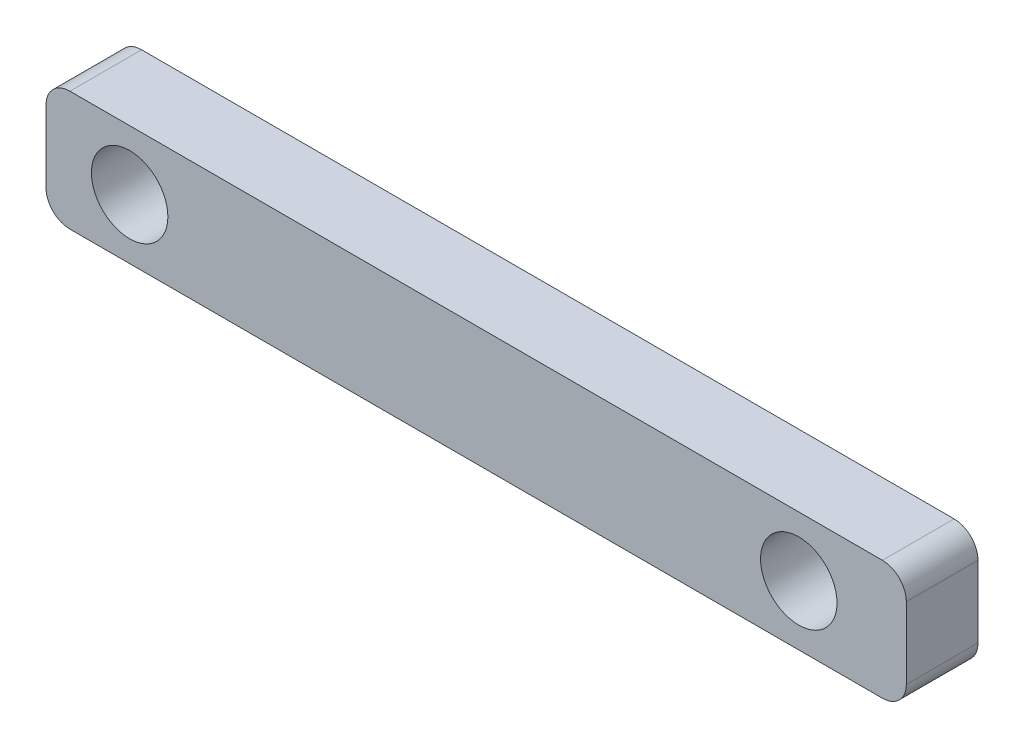
ISO-10303-21;
HEADER;
FILE_DESCRIPTION(('STEP AP214'),'2;1');
FILE_NAME('part.step','',(''),(''),'','','');
FILE_SCHEMA(('AUTOMOTIVE_DESIGN { 1 0 10303 214 1 1 1 1 }'));
ENDSEC;
DATA;
#1=APPLICATION_CONTEXT('core data for automotive mechanical design processes');
#2=APPLICATION_PROTOCOL_DEFINITION('international standard','automotive_design',2000,#1);
#3=PRODUCT_CONTEXT('',#1,'mechanical');
#4=PRODUCT('Part','Part','',(#3));
#5=PRODUCT_RELATED_PRODUCT_CATEGORY('part','',(#4));
#6=PRODUCT_DEFINITION_FORMATION('','',#4);
#7=PRODUCT_DEFINITION_CONTEXT('part definition',#1,'design');
#8=PRODUCT_DEFINITION('design','',#6,#7);
#9=PRODUCT_DEFINITION_SHAPE('','',#8);
#10=(LENGTH_UNIT() NAMED_UNIT(*) SI_UNIT(.MILLI.,.METRE.));
#11=(NAMED_UNIT(*) PLANE_ANGLE_UNIT() SI_UNIT($,.RADIAN.));
#12=(NAMED_UNIT(*) SI_UNIT($,.STERADIAN.) SOLID_ANGLE_UNIT());
#13=UNCERTAINTY_MEASURE_WITH_UNIT(LENGTH_MEASURE(1.E-05),#10,'distance_accuracy_value','');
#14=(GEOMETRIC_REPRESENTATION_CONTEXT(3) GLOBAL_UNCERTAINTY_ASSIGNED_CONTEXT((#13)) GLOBAL_UNIT_ASSIGNED_CONTEXT((#10,
#11,#12)) REPRESENTATION_CONTEXT('',''));
#15=CARTESIAN_POINT('',(0.,0.,0.));
#16=DIRECTION('',(0.,0.,1.));
#17=DIRECTION('',(1.,0.,0.));
#18=AXIS2_PLACEMENT_3D('',#15,#16,#17);
#19=CARTESIAN_POINT('',(46.825055764785,-11.3855235849937,3.));
#20=DIRECTION('',(0.,0.,1.));
#21=DIRECTION('',(1.,0.,0.));
#22=AXIS2_PLACEMENT_3D('',#19,#20,#21);
#23=PLANE('',#22);
#24=CARTESIAN_POINT('',(15.325055764785,-9.88552358499371,3.));
#25=DIRECTION('',(0.,0.,1.));
#26=DIRECTION('',(1.,0.,0.));
#27=AXIS2_PLACEMENT_3D('',#24,#25,#26);
#28=CIRCLE('',#27,1.59999999999999);
#29=CARTESIAN_POINT('',(16.925055764785,-9.88552358499371,3.));
#30=VERTEX_POINT('',#29);
#31=EDGE_CURVE('E138',#30,#30,#28,.T.);
#32=ORIENTED_EDGE('',*,*,#31,.F.);
#33=EDGE_LOOP('',(#32));
#34=FACE_BOUND('',#33,.T.);
#35=CARTESIAN_POINT('',(46.825055764785,-11.3855235849937,3.));
#36=DIRECTION('',(0.,0.,1.));
#37=DIRECTION('',(1.,0.,0.));
#38=AXIS2_PLACEMENT_3D('',#35,#36,#37);
#39=CIRCLE('',#38,1.);
#40=CARTESIAN_POINT('',(46.825055764785,-12.3855235849937,3.));
#41=VERTEX_POINT('',#40);
#42=CARTESIAN_POINT('',(47.825055764785,-11.3855235849937,3.));
#43=VERTEX_POINT('',#42);
#44=EDGE_CURVE('E149',#41,#43,#39,.T.);
#45=ORIENTED_EDGE('',*,*,#44,.T.);
#46=DIRECTION('',(0.,1.,0.));
#47=VECTOR('',#46,1.);
#48=CARTESIAN_POINT('',(47.825055764785,-8.38552358499372,3.));
#49=LINE('',#48,#47);
#50=CARTESIAN_POINT('',(47.825055764785,-8.38552358499372,3.));
#51=VERTEX_POINT('',#50);
#52=EDGE_CURVE('E97',#43,#51,#49,.T.);
#53=ORIENTED_EDGE('',*,*,#52,.T.);
#54=CARTESIAN_POINT('',(46.825055764785,-8.38552358499371,3.));
#55=DIRECTION('',(0.,0.,1.));
#56=DIRECTION('',(1.,0.,0.));
#57=AXIS2_PLACEMENT_3D('',#54,#55,#56);
#58=CIRCLE('',#57,1.);
#59=CARTESIAN_POINT('',(46.825055764785,-7.38552358499371,3.));
#60=VERTEX_POINT('',#59);
#61=EDGE_CURVE('E164',#51,#60,#58,.T.);
#62=ORIENTED_EDGE('',*,*,#61,.T.);
#63=DIRECTION('',(-1.,0.,0.));
#64=VECTOR('',#63,1.);
#65=CARTESIAN_POINT('',(12.825055764785,-7.38552358499371,3.));
#66=LINE('',#65,#64);
#67=CARTESIAN_POINT('',(12.825055764785,-7.38552358499371,3.));
#68=VERTEX_POINT('',#67);
#69=EDGE_CURVE('E177',#60,#68,#66,.T.);
#70=ORIENTED_EDGE('',*,*,#69,.T.);
#71=CARTESIAN_POINT('',(12.825055764785,-8.38552358499371,3.));
#72=DIRECTION('',(0.,0.,1.));
#73=DIRECTION('',(-1.,0.,0.));
#74=AXIS2_PLACEMENT_3D('',#71,#72,#73);
#75=CIRCLE('',#74,0.999999999999999);
#76=CARTESIAN_POINT('',(11.825055764785,-8.38552358499372,3.));
#77=VERTEX_POINT('',#76);
#78=EDGE_CURVE('E116',#68,#77,#75,.T.);
#79=ORIENTED_EDGE('',*,*,#78,.T.);
#80=DIRECTION('',(0.,-1.,0.));
#81=VECTOR('',#80,1.);
#82=CARTESIAN_POINT('',(11.825055764785,-8.38552358499372,3.));
#83=LINE('',#82,#81);
#84=CARTESIAN_POINT('',(11.825055764785,-11.3855235849937,3.));
#85=VERTEX_POINT('',#84);
#86=EDGE_CURVE('E110',#77,#85,#83,.T.);
#87=ORIENTED_EDGE('',*,*,#86,.T.);
#88=CARTESIAN_POINT('',(12.825055764785,-11.3855235849937,3.));
#89=DIRECTION('',(0.,0.,1.));
#90=DIRECTION('',(-1.,0.,0.));
#91=AXIS2_PLACEMENT_3D('',#88,#89,#90);
#92=CIRCLE('',#91,0.999999999999999);
#93=CARTESIAN_POINT('',(12.825055764785,-12.3855235849937,3.));
#94=VERTEX_POINT('',#93);
#95=EDGE_CURVE('E114',#85,#94,#92,.T.);
#96=ORIENTED_EDGE('',*,*,#95,.T.);
#97=DIRECTION('',(1.,0.,0.));
#98=VECTOR('',#97,1.);
#99=CARTESIAN_POINT('',(12.825055764785,-12.3855235849937,3.));
#100=LINE('',#99,#98);
#101=EDGE_CURVE('E54',#94,#41,#100,.T.);
#102=ORIENTED_EDGE('',*,*,#101,.T.);
#103=EDGE_LOOP('',(#45,#53,#62,#70,#79,#87,#96,#102));
#104=FACE_BOUND('',#103,.T.);
#105=CARTESIAN_POINT('',(43.325055764785,-9.88552358499371,3.));
#106=DIRECTION('',(0.,0.,1.));
#107=DIRECTION('',(1.,0.,0.));
#108=AXIS2_PLACEMENT_3D('',#105,#106,#107);
#109=CIRCLE('',#108,1.6);
#110=CARTESIAN_POINT('',(44.925055764785,-9.88552358499371,3.));
#111=VERTEX_POINT('',#110);
#112=EDGE_CURVE('E186',#111,#111,#109,.T.);
#113=ORIENTED_EDGE('',*,*,#112,.F.);
#114=EDGE_LOOP('',(#113));
#115=FACE_BOUND('',#114,.T.);
#116=ADVANCED_FACE('F37',(#34,#104,#115),#23,.T.);
#117=CARTESIAN_POINT('',(46.825055764785,-11.3855235849937,0.));
#118=DIRECTION('',(0.,0.,1.));
#119=DIRECTION('',(1.,0.,0.));
#120=AXIS2_PLACEMENT_3D('',#117,#118,#119);
#121=PLANE('',#120);
#122=CARTESIAN_POINT('',(46.825055764785,-11.3855235849937,0.));
#123=DIRECTION('',(0.,0.,1.));
#124=DIRECTION('',(1.,0.,0.));
#125=AXIS2_PLACEMENT_3D('',#122,#123,#124);
#126=CIRCLE('',#125,1.);
#127=CARTESIAN_POINT('',(46.825055764785,-12.3855235849937,0.));
#128=VERTEX_POINT('',#127);
#129=CARTESIAN_POINT('',(47.825055764785,-11.3855235849937,0.));
#130=VERTEX_POINT('',#129);
#131=EDGE_CURVE('E134',#128,#130,#126,.T.);
#132=ORIENTED_EDGE('',*,*,#131,.F.);
#133=DIRECTION('',(1.,0.,0.));
#134=VECTOR('',#133,1.);
#135=CARTESIAN_POINT('',(12.825055764785,-12.3855235849937,0.));
#136=LINE('',#135,#134);
#137=CARTESIAN_POINT('',(12.825055764785,-12.3855235849937,0.));
#138=VERTEX_POINT('',#137);
#139=EDGE_CURVE('E89',#138,#128,#136,.T.);
#140=ORIENTED_EDGE('',*,*,#139,.F.);
#141=CARTESIAN_POINT('',(12.825055764785,-11.3855235849937,0.));
#142=DIRECTION('',(0.,0.,1.));
#143=DIRECTION('',(-1.,0.,0.));
#144=AXIS2_PLACEMENT_3D('',#141,#142,#143);
#145=CIRCLE('',#144,0.999999999999999);
#146=CARTESIAN_POINT('',(11.825055764785,-11.3855235849937,0.));
#147=VERTEX_POINT('',#146);
#148=EDGE_CURVE('E83',#147,#138,#145,.T.);
#149=ORIENTED_EDGE('',*,*,#148,.F.);
#150=DIRECTION('',(0.,-1.,0.));
#151=VECTOR('',#150,1.);
#152=CARTESIAN_POINT('',(11.825055764785,-8.38552358499372,0.));
#153=LINE('',#152,#151);
#154=CARTESIAN_POINT('',(11.825055764785,-8.38552358499372,0.));
#155=VERTEX_POINT('',#154);
#156=EDGE_CURVE('E124',#155,#147,#153,.T.);
#157=ORIENTED_EDGE('',*,*,#156,.F.);
#158=CARTESIAN_POINT('',(12.825055764785,-8.38552358499371,0.));
#159=DIRECTION('',(0.,0.,1.));
#160=DIRECTION('',(-1.,0.,0.));
#161=AXIS2_PLACEMENT_3D('',#158,#159,#160);
#162=CIRCLE('',#161,0.999999999999999);
#163=CARTESIAN_POINT('',(12.825055764785,-7.38552358499371,0.));
#164=VERTEX_POINT('',#163);
#165=EDGE_CURVE('E144',#164,#155,#162,.T.);
#166=ORIENTED_EDGE('',*,*,#165,.F.);
#167=DIRECTION('',(-1.,0.,0.));
#168=VECTOR('',#167,1.);
#169=CARTESIAN_POINT('',(12.825055764785,-7.38552358499371,0.));
#170=LINE('',#169,#168);
#171=CARTESIAN_POINT('',(46.825055764785,-7.38552358499371,0.));
#172=VERTEX_POINT('',#171);
#173=EDGE_CURVE('E142',#172,#164,#170,.T.);
#174=ORIENTED_EDGE('',*,*,#173,.F.);
#175=CARTESIAN_POINT('',(46.825055764785,-8.38552358499371,0.));
#176=DIRECTION('',(0.,0.,1.));
#177=DIRECTION('',(1.,0.,0.));
#178=AXIS2_PLACEMENT_3D('',#175,#176,#177);
#179=CIRCLE('',#178,1.);
#180=CARTESIAN_POINT('',(47.825055764785,-8.38552358499372,0.));
#181=VERTEX_POINT('',#180);
#182=EDGE_CURVE('E140',#181,#172,#179,.T.);
#183=ORIENTED_EDGE('',*,*,#182,.F.);
#184=DIRECTION('',(0.,1.,0.));
#185=VECTOR('',#184,1.);
#186=CARTESIAN_POINT('',(47.825055764785,-8.38552358499372,0.));
#187=LINE('',#186,#185);
#188=EDGE_CURVE('E137',#130,#181,#187,.T.);
#189=ORIENTED_EDGE('',*,*,#188,.F.);
#190=EDGE_LOOP('',(#132,#140,#149,#157,#166,#174,#183,#189));
#191=FACE_BOUND('',#190,.T.);
#192=CARTESIAN_POINT('',(15.325055764785,-9.88552358499371,0.));
#193=DIRECTION('',(0.,0.,1.));
#194=DIRECTION('',(1.,0.,0.));
#195=AXIS2_PLACEMENT_3D('',#192,#193,#194);
#196=CIRCLE('',#195,1.59999999999999);
#197=CARTESIAN_POINT('',(16.925055764785,-9.88552358499371,0.));
#198=VERTEX_POINT('',#197);
#199=EDGE_CURVE('E183',#198,#198,#196,.T.);
#200=ORIENTED_EDGE('',*,*,#199,.T.);
#201=EDGE_LOOP('',(#200));
#202=FACE_BOUND('',#201,.T.);
#203=CARTESIAN_POINT('',(43.325055764785,-9.88552358499371,0.));
#204=DIRECTION('',(0.,0.,1.));
#205=DIRECTION('',(1.,0.,0.));
#206=AXIS2_PLACEMENT_3D('',#203,#204,#205);
#207=CIRCLE('',#206,1.6);
#208=CARTESIAN_POINT('',(44.925055764785,-9.88552358499371,0.));
#209=VERTEX_POINT('',#208);
#210=EDGE_CURVE('E189',#209,#209,#207,.T.);
#211=ORIENTED_EDGE('',*,*,#210,.T.);
#212=EDGE_LOOP('',(#211));
#213=FACE_BOUND('',#212,.T.);
#214=ADVANCED_FACE('F168',(#191,#202,#213),#121,.F.);
#215=CARTESIAN_POINT('',(46.825055764785,-11.3855235849937,3.));
#216=DIRECTION('',(0.,0.,-1.));
#217=DIRECTION('',(-1.,0.,0.));
#218=AXIS2_PLACEMENT_3D('',#215,#216,#217);
#219=CYLINDRICAL_SURFACE('',#218,1.);
#220=ORIENTED_EDGE('',*,*,#131,.T.);
#221=DIRECTION('',(0.,0.,-1.));
#222=VECTOR('',#221,1.);
#223=CARTESIAN_POINT('',(47.825055764785,-11.3855235849937,3.));
#224=LINE('',#223,#222);
#225=EDGE_CURVE('E11',#43,#130,#224,.T.);
#226=ORIENTED_EDGE('',*,*,#225,.F.);
#227=ORIENTED_EDGE('',*,*,#44,.F.);
#228=DIRECTION('',(0.,0.,-1.));
#229=VECTOR('',#228,1.);
#230=CARTESIAN_POINT('',(46.825055764785,-12.3855235849937,3.));
#231=LINE('',#230,#229);
#232=EDGE_CURVE('E130',#41,#128,#231,.T.);
#233=ORIENTED_EDGE('',*,*,#232,.T.);
#234=EDGE_LOOP('',(#220,#226,#227,#233));
#235=FACE_BOUND('',#234,.T.);
#236=ADVANCED_FACE('F39',(#235),#219,.T.);
#237=CARTESIAN_POINT('',(47.825055764785,-8.38552358499372,3.));
#238=DIRECTION('',(-1.,0.,0.));
#239=DIRECTION('',(0.,0.,1.));
#240=AXIS2_PLACEMENT_3D('',#237,#238,#239);
#241=PLANE('',#240);
#242=ORIENTED_EDGE('',*,*,#188,.T.);
#243=DIRECTION('',(0.,0.,-1.));
#244=VECTOR('',#243,1.);
#245=CARTESIAN_POINT('',(47.825055764785,-8.38552358499372,3.));
#246=LINE('',#245,#244);
#247=EDGE_CURVE('E46',#51,#181,#246,.T.);
#248=ORIENTED_EDGE('',*,*,#247,.F.);
#249=ORIENTED_EDGE('',*,*,#52,.F.);
#250=ORIENTED_EDGE('',*,*,#225,.T.);
#251=EDGE_LOOP('',(#242,#248,#249,#250));
#252=FACE_BOUND('',#251,.T.);
#253=ADVANCED_FACE('F221',(#252),#241,.F.);
#254=CARTESIAN_POINT('',(46.825055764785,-8.38552358499371,3.));
#255=DIRECTION('',(0.,0.,-1.));
#256=DIRECTION('',(-1.,0.,0.));
#257=AXIS2_PLACEMENT_3D('',#254,#255,#256);
#258=CYLINDRICAL_SURFACE('',#257,1.);
#259=ORIENTED_EDGE('',*,*,#182,.T.);
#260=DIRECTION('',(0.,0.,-1.));
#261=VECTOR('',#260,1.);
#262=CARTESIAN_POINT('',(46.825055764785,-7.38552358499371,3.));
#263=LINE('',#262,#261);
#264=EDGE_CURVE('E156',#60,#172,#263,.T.);
#265=ORIENTED_EDGE('',*,*,#264,.F.);
#266=ORIENTED_EDGE('',*,*,#61,.F.);
#267=ORIENTED_EDGE('',*,*,#247,.T.);
#268=EDGE_LOOP('',(#259,#265,#266,#267));
#269=FACE_BOUND('',#268,.T.);
#270=ADVANCED_FACE('F162',(#269),#258,.T.);
#271=CARTESIAN_POINT('',(12.825055764785,-7.38552358499371,3.));
#272=DIRECTION('',(0.,-1.,0.));
#273=DIRECTION('',(0.,0.,-1.));
#274=AXIS2_PLACEMENT_3D('',#271,#272,#273);
#275=PLANE('',#274);
#276=ORIENTED_EDGE('',*,*,#173,.T.);
#277=DIRECTION('',(0.,0.,-1.));
#278=VECTOR('',#277,1.);
#279=CARTESIAN_POINT('',(12.825055764785,-7.38552358499371,3.));
#280=LINE('',#279,#278);
#281=EDGE_CURVE('E153',#68,#164,#280,.T.);
#282=ORIENTED_EDGE('',*,*,#281,.F.);
#283=ORIENTED_EDGE('',*,*,#69,.F.);
#284=ORIENTED_EDGE('',*,*,#264,.T.);
#285=EDGE_LOOP('',(#276,#282,#283,#284));
#286=FACE_BOUND('',#285,.T.);
#287=ADVANCED_FACE('F173',(#286),#275,.F.);
#288=CARTESIAN_POINT('',(12.825055764785,-8.38552358499371,3.));
#289=DIRECTION('',(0.,0.,-1.));
#290=DIRECTION('',(-1.,0.,0.));
#291=AXIS2_PLACEMENT_3D('',#288,#289,#290);
#292=CYLINDRICAL_SURFACE('',#291,0.999999999999999);
#293=ORIENTED_EDGE('',*,*,#165,.T.);
#294=DIRECTION('',(0.,0.,-1.));
#295=VECTOR('',#294,1.);
#296=CARTESIAN_POINT('',(11.825055764785,-8.38552358499372,3.));
#297=LINE('',#296,#295);
#298=EDGE_CURVE('E125',#77,#155,#297,.T.);
#299=ORIENTED_EDGE('',*,*,#298,.F.);
#300=ORIENTED_EDGE('',*,*,#78,.F.);
#301=ORIENTED_EDGE('',*,*,#281,.T.);
#302=EDGE_LOOP('',(#293,#299,#300,#301));
#303=FACE_BOUND('',#302,.T.);
#304=ADVANCED_FACE('F176',(#303),#292,.T.);
#305=CARTESIAN_POINT('',(11.825055764785,-8.38552358499372,3.));
#306=DIRECTION('',(1.,0.,0.));
#307=DIRECTION('',(0.,0.,-1.));
#308=AXIS2_PLACEMENT_3D('',#305,#306,#307);
#309=PLANE('',#308);
#310=ORIENTED_EDGE('',*,*,#156,.T.);
#311=DIRECTION('',(0.,0.,-1.));
#312=VECTOR('',#311,1.);
#313=CARTESIAN_POINT('',(11.825055764785,-11.3855235849937,3.));
#314=LINE('',#313,#312);
#315=EDGE_CURVE('E121',#85,#147,#314,.T.);
#316=ORIENTED_EDGE('',*,*,#315,.F.);
#317=ORIENTED_EDGE('',*,*,#86,.F.);
#318=ORIENTED_EDGE('',*,*,#298,.T.);
#319=EDGE_LOOP('',(#310,#316,#317,#318));
#320=FACE_BOUND('',#319,.T.);
#321=ADVANCED_FACE('F122',(#320),#309,.F.);
#322=CARTESIAN_POINT('',(12.825055764785,-11.3855235849937,3.));
#323=DIRECTION('',(0.,0.,-1.));
#324=DIRECTION('',(-1.,0.,0.));
#325=AXIS2_PLACEMENT_3D('',#322,#323,#324);
#326=CYLINDRICAL_SURFACE('',#325,0.999999999999999);
#327=ORIENTED_EDGE('',*,*,#148,.T.);
#328=DIRECTION('',(0.,0.,-1.));
#329=VECTOR('',#328,1.);
#330=CARTESIAN_POINT('',(12.825055764785,-12.3855235849937,3.));
#331=LINE('',#330,#329);
#332=EDGE_CURVE('E126',#94,#138,#331,.T.);
#333=ORIENTED_EDGE('',*,*,#332,.F.);
#334=ORIENTED_EDGE('',*,*,#95,.F.);
#335=ORIENTED_EDGE('',*,*,#315,.T.);
#336=EDGE_LOOP('',(#327,#333,#334,#335));
#337=FACE_BOUND('',#336,.T.);
#338=ADVANCED_FACE('F128',(#337),#326,.T.);
#339=CARTESIAN_POINT('',(12.825055764785,-12.3855235849937,3.));
#340=DIRECTION('',(0.,1.,0.));
#341=DIRECTION('',(-1.,0.,0.));
#342=AXIS2_PLACEMENT_3D('',#339,#340,#341);
#343=PLANE('',#342);
#344=ORIENTED_EDGE('',*,*,#139,.T.);
#345=ORIENTED_EDGE('',*,*,#232,.F.);
#346=ORIENTED_EDGE('',*,*,#101,.F.);
#347=ORIENTED_EDGE('',*,*,#332,.T.);
#348=EDGE_LOOP('',(#344,#345,#346,#347));
#349=FACE_BOUND('',#348,.T.);
#350=ADVANCED_FACE('F209',(#349),#343,.F.);
#351=CARTESIAN_POINT('',(15.325055764785,-9.88552358499371,3.));
#352=DIRECTION('',(0.,0.,-1.));
#353=DIRECTION('',(-1.,0.,0.));
#354=AXIS2_PLACEMENT_3D('',#351,#352,#353);
#355=CYLINDRICAL_SURFACE('',#354,1.59999999999999);
#356=ORIENTED_EDGE('',*,*,#31,.T.);
#357=EDGE_LOOP('',(#356));
#358=FACE_BOUND('',#357,.T.);
#359=ORIENTED_EDGE('',*,*,#199,.F.);
#360=EDGE_LOOP('',(#359));
#361=FACE_BOUND('',#360,.T.);
#362=ADVANCED_FACE('F206',(#358,#361),#355,.F.);
#363=CARTESIAN_POINT('',(43.325055764785,-9.88552358499371,3.));
#364=DIRECTION('',(0.,0.,-1.));
#365=DIRECTION('',(-1.,0.,0.));
#366=AXIS2_PLACEMENT_3D('',#363,#364,#365);
#367=CYLINDRICAL_SURFACE('',#366,1.6);
#368=ORIENTED_EDGE('',*,*,#112,.T.);
#369=EDGE_LOOP('',(#368));
#370=FACE_BOUND('',#369,.T.);
#371=ORIENTED_EDGE('',*,*,#210,.F.);
#372=EDGE_LOOP('',(#371));
#373=FACE_BOUND('',#372,.T.);
#374=ADVANCED_FACE('F195',(#370,#373),#367,.F.);
#375=CLOSED_SHELL('',(#116,#214,#236,#253,#270,#287,#304,#321,#338,#350,#362,#374));
#376=MANIFOLD_SOLID_BREP('B2',#375);
#377=ADVANCED_BREP_SHAPE_REPRESENTATION('',(#18,#376),#14);
#378=SHAPE_DEFINITION_REPRESENTATION(#9,#377);
ENDSEC;
END-ISO-10303-21;
